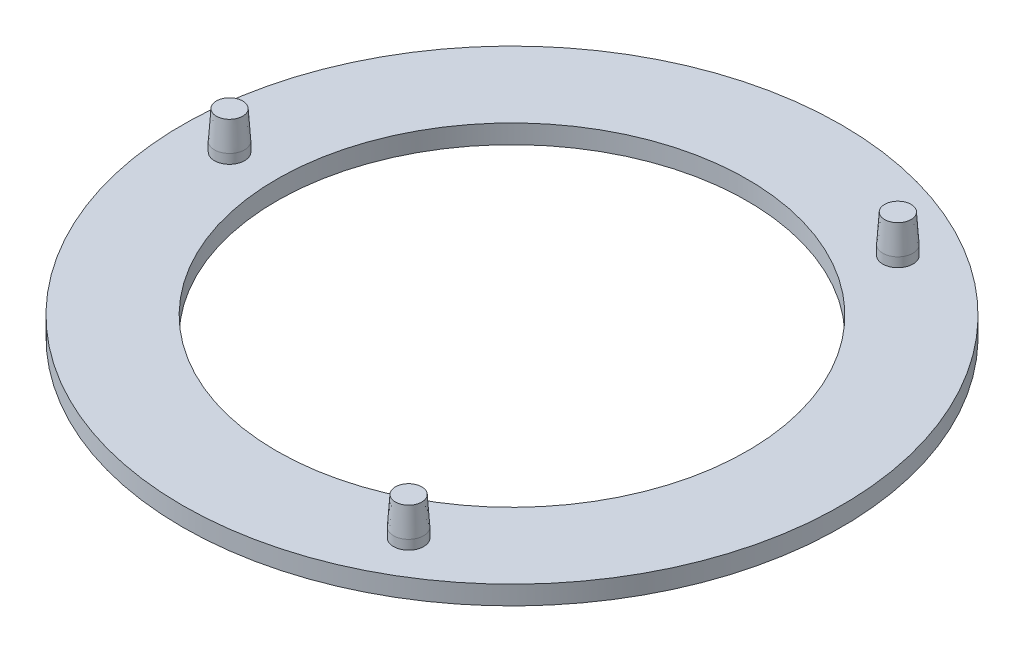
ISO-10303-21;
HEADER;
FILE_DESCRIPTION(('STEP AP214'),'2;1');
FILE_NAME('part.step','',(''),(''),'','','');
FILE_SCHEMA(('AUTOMOTIVE_DESIGN { 1 0 10303 214 1 1 1 1 }'));
ENDSEC;
DATA;
#1=APPLICATION_CONTEXT('core data for automotive mechanical design processes');
#2=APPLICATION_PROTOCOL_DEFINITION('international standard','automotive_design',2000,#1);
#3=PRODUCT_CONTEXT('',#1,'mechanical');
#4=PRODUCT('Part','Part','',(#3));
#5=PRODUCT_RELATED_PRODUCT_CATEGORY('part','',(#4));
#6=PRODUCT_DEFINITION_FORMATION('','',#4);
#7=PRODUCT_DEFINITION_CONTEXT('part definition',#1,'design');
#8=PRODUCT_DEFINITION('design','',#6,#7);
#9=PRODUCT_DEFINITION_SHAPE('','',#8);
#10=(LENGTH_UNIT() NAMED_UNIT(*) SI_UNIT(.MILLI.,.METRE.));
#11=(NAMED_UNIT(*) PLANE_ANGLE_UNIT() SI_UNIT($,.RADIAN.));
#12=(NAMED_UNIT(*) SI_UNIT($,.STERADIAN.) SOLID_ANGLE_UNIT());
#13=UNCERTAINTY_MEASURE_WITH_UNIT(LENGTH_MEASURE(1.E-05),#10,'distance_accuracy_value','');
#14=(GEOMETRIC_REPRESENTATION_CONTEXT(3) GLOBAL_UNCERTAINTY_ASSIGNED_CONTEXT((#13)) GLOBAL_UNIT_ASSIGNED_CONTEXT((#10,
#11,#12)) REPRESENTATION_CONTEXT('',''));
#15=CARTESIAN_POINT('',(0.,0.,0.));
#16=DIRECTION('',(0.,0.,1.));
#17=DIRECTION('',(1.,0.,0.));
#18=AXIS2_PLACEMENT_3D('',#15,#16,#17);
#19=CARTESIAN_POINT('',(0.,2.54,0.));
#20=DIRECTION('',(0.,1.,0.));
#21=DIRECTION('',(0.,0.,1.));
#22=AXIS2_PLACEMENT_3D('',#19,#20,#21);
#23=PLANE('',#22);
#24=CARTESIAN_POINT('',(19.0500000000001,2.54,-32.9955678841871));
#25=DIRECTION('',(0.,-1.,0.));
#26=DIRECTION('',(0.866025403784438,0.,0.500000000000002));
#27=AXIS2_PLACEMENT_3D('',#24,#25,#26);
#28=CIRCLE('',#27,2.032);
#29=CARTESIAN_POINT('',(20.80976362049,2.54,-31.9795678841871));
#30=VERTEX_POINT('',#29);
#31=EDGE_CURVE('E63',#30,#30,#28,.T.);
#32=ORIENTED_EDGE('',*,*,#31,.T.);
#33=EDGE_LOOP('',(#32));
#34=FACE_BOUND('',#33,.T.);
#35=CARTESIAN_POINT('',(0.,2.54,0.));
#36=DIRECTION('',(0.,1.,0.));
#37=DIRECTION('',(0.,0.,1.));
#38=AXIS2_PLACEMENT_3D('',#35,#36,#37);
#39=CIRCLE('',#38,31.75);
#40=CARTESIAN_POINT('',(0.,2.54,31.75));
#41=VERTEX_POINT('',#40);
#42=EDGE_CURVE('E41',#41,#41,#39,.T.);
#43=ORIENTED_EDGE('',*,*,#42,.F.);
#44=EDGE_LOOP('',(#43));
#45=FACE_BOUND('',#44,.T.);
#46=CARTESIAN_POINT('',(0.,2.54,0.));
#47=DIRECTION('',(0.,1.,0.));
#48=DIRECTION('',(0.,0.,1.));
#49=AXIS2_PLACEMENT_3D('',#46,#47,#48);
#50=CIRCLE('',#49,44.45);
#51=CARTESIAN_POINT('',(0.,2.54,44.45));
#52=VERTEX_POINT('',#51);
#53=EDGE_CURVE('E10',#52,#52,#50,.T.);
#54=ORIENTED_EDGE('',*,*,#53,.T.);
#55=EDGE_LOOP('',(#54));
#56=FACE_BOUND('',#55,.T.);
#57=CARTESIAN_POINT('',(-38.1,2.54,0.));
#58=DIRECTION('',(0.,-1.,0.));
#59=DIRECTION('',(0.,0.,-1.));
#60=AXIS2_PLACEMENT_3D('',#57,#58,#59);
#61=CIRCLE('',#60,2.032);
#62=CARTESIAN_POINT('',(-38.1,2.54,-2.032));
#63=VERTEX_POINT('',#62);
#64=EDGE_CURVE('E54',#63,#63,#61,.T.);
#65=ORIENTED_EDGE('',*,*,#64,.T.);
#66=EDGE_LOOP('',(#65));
#67=FACE_BOUND('',#66,.T.);
#68=CARTESIAN_POINT('',(19.0499999999999,2.54,32.9955678841872));
#69=DIRECTION('',(0.,-1.,0.));
#70=DIRECTION('',(-0.866025403784441,0.,0.499999999999997));
#71=AXIS2_PLACEMENT_3D('',#68,#69,#70);
#72=CIRCLE('',#71,2.032);
#73=CARTESIAN_POINT('',(17.2902363795099,2.54,34.0115678841872));
#74=VERTEX_POINT('',#73);
#75=EDGE_CURVE('E72',#74,#74,#72,.T.);
#76=ORIENTED_EDGE('',*,*,#75,.T.);
#77=EDGE_LOOP('',(#76));
#78=FACE_BOUND('',#77,.T.);
#79=ADVANCED_FACE('F30',(#34,#45,#56,#67,#78),#23,.T.);
#80=CARTESIAN_POINT('',(0.,0.,0.));
#81=DIRECTION('',(0.,1.,0.));
#82=DIRECTION('',(0.,0.,1.));
#83=AXIS2_PLACEMENT_3D('',#80,#81,#82);
#84=PLANE('',#83);
#85=CARTESIAN_POINT('',(0.,0.,0.));
#86=DIRECTION('',(0.,1.,0.));
#87=DIRECTION('',(0.,0.,1.));
#88=AXIS2_PLACEMENT_3D('',#85,#86,#87);
#89=CIRCLE('',#88,44.45);
#90=CARTESIAN_POINT('',(0.,0.,44.45));
#91=VERTEX_POINT('',#90);
#92=EDGE_CURVE('E34',#91,#91,#89,.T.);
#93=ORIENTED_EDGE('',*,*,#92,.F.);
#94=EDGE_LOOP('',(#93));
#95=FACE_BOUND('',#94,.T.);
#96=CARTESIAN_POINT('',(0.,0.,0.));
#97=DIRECTION('',(0.,1.,0.));
#98=DIRECTION('',(0.,0.,1.));
#99=AXIS2_PLACEMENT_3D('',#96,#97,#98);
#100=CIRCLE('',#99,31.75);
#101=CARTESIAN_POINT('',(0.,0.,31.75));
#102=VERTEX_POINT('',#101);
#103=EDGE_CURVE('E43',#102,#102,#100,.T.);
#104=ORIENTED_EDGE('',*,*,#103,.T.);
#105=EDGE_LOOP('',(#104));
#106=FACE_BOUND('',#105,.T.);
#107=ADVANCED_FACE('F100',(#95,#106),#84,.F.);
#108=CARTESIAN_POINT('',(0.,2.54,0.));
#109=DIRECTION('',(0.,-1.,0.));
#110=DIRECTION('',(0.,0.,-1.));
#111=AXIS2_PLACEMENT_3D('',#108,#109,#110);
#112=CYLINDRICAL_SURFACE('',#111,44.45);
#113=ORIENTED_EDGE('',*,*,#53,.F.);
#114=EDGE_LOOP('',(#113));
#115=FACE_BOUND('',#114,.T.);
#116=ORIENTED_EDGE('',*,*,#92,.T.);
#117=EDGE_LOOP('',(#116));
#118=FACE_BOUND('',#117,.T.);
#119=ADVANCED_FACE('F32',(#115,#118),#112,.T.);
#120=CARTESIAN_POINT('',(0.,2.54,0.));
#121=DIRECTION('',(0.,-1.,0.));
#122=DIRECTION('',(0.,0.,-1.));
#123=AXIS2_PLACEMENT_3D('',#120,#121,#122);
#124=CYLINDRICAL_SURFACE('',#123,31.75);
#125=ORIENTED_EDGE('',*,*,#42,.T.);
#126=EDGE_LOOP('',(#125));
#127=FACE_BOUND('',#126,.T.);
#128=ORIENTED_EDGE('',*,*,#103,.F.);
#129=EDGE_LOOP('',(#128));
#130=FACE_BOUND('',#129,.T.);
#131=ADVANCED_FACE('F109',(#127,#130),#124,.F.);
#132=CARTESIAN_POINT('',(-38.1,7.62,0.));
#133=DIRECTION('',(0.,-1.,0.));
#134=DIRECTION('',(0.,0.,-1.));
#135=AXIS2_PLACEMENT_3D('',#132,#133,#134);
#136=PLANE('',#135);
#137=CARTESIAN_POINT('',(-38.1,7.62,0.));
#138=DIRECTION('',(0.,-1.,0.));
#139=DIRECTION('',(0.,0.,-1.));
#140=AXIS2_PLACEMENT_3D('',#137,#138,#139);
#141=CIRCLE('',#140,1.778);
#142=CARTESIAN_POINT('',(-38.1,7.62,-1.778));
#143=VERTEX_POINT('',#142);
#144=EDGE_CURVE('E46',#143,#143,#141,.T.);
#145=ORIENTED_EDGE('',*,*,#144,.F.);
#146=EDGE_LOOP('',(#145));
#147=FACE_BOUND('',#146,.T.);
#148=ADVANCED_FACE('F112',(#147),#136,.F.);
#149=CARTESIAN_POINT('',(-38.1,7.62,0.));
#150=DIRECTION('',(0.,-1.,0.));
#151=DIRECTION('',(0.,0.,-1.));
#152=AXIS2_PLACEMENT_3D('',#149,#150,#151);
#153=CONICAL_SURFACE('',#152,1.778,0.0665681637758231);
#154=CARTESIAN_POINT('',(-38.1,3.81,0.));
#155=DIRECTION('',(0.,-1.,0.));
#156=DIRECTION('',(0.,0.,-1.));
#157=AXIS2_PLACEMENT_3D('',#154,#155,#156);
#158=CIRCLE('',#157,2.032);
#159=CARTESIAN_POINT('',(-38.1,3.81,-2.032));
#160=VERTEX_POINT('',#159);
#161=EDGE_CURVE('E51',#160,#160,#158,.T.);
#162=ORIENTED_EDGE('',*,*,#161,.F.);
#163=EDGE_LOOP('',(#162));
#164=FACE_BOUND('',#163,.T.);
#165=ORIENTED_EDGE('',*,*,#144,.T.);
#166=EDGE_LOOP('',(#165));
#167=FACE_BOUND('',#166,.T.);
#168=ADVANCED_FACE('F116',(#164,#167),#153,.T.);
#169=CARTESIAN_POINT('',(-38.1,2.54,0.));
#170=DIRECTION('',(0.,-1.,0.));
#171=DIRECTION('',(0.,0.,-1.));
#172=AXIS2_PLACEMENT_3D('',#169,#170,#171);
#173=CYLINDRICAL_SURFACE('',#172,2.032);
#174=ORIENTED_EDGE('',*,*,#64,.F.);
#175=EDGE_LOOP('',(#174));
#176=FACE_BOUND('',#175,.T.);
#177=ORIENTED_EDGE('',*,*,#161,.T.);
#178=EDGE_LOOP('',(#177));
#179=FACE_BOUND('',#178,.T.);
#180=ADVANCED_FACE('F120',(#176,#179),#173,.T.);
#181=CARTESIAN_POINT('',(19.0500000000001,7.62,-32.9955678841871));
#182=DIRECTION('',(0.,-1.,0.));
#183=DIRECTION('',(0.866025403784438,0.,0.500000000000002));
#184=AXIS2_PLACEMENT_3D('',#181,#182,#183);
#185=PLANE('',#184);
#186=CARTESIAN_POINT('',(19.0500000000001,7.62,-32.9955678841871));
#187=DIRECTION('',(0.,-1.,0.));
#188=DIRECTION('',(0.866025403784438,0.,0.500000000000002));
#189=AXIS2_PLACEMENT_3D('',#186,#187,#188);
#190=CIRCLE('',#189,1.778);
#191=CARTESIAN_POINT('',(20.5897931679288,7.62,-32.1065678841871));
#192=VERTEX_POINT('',#191);
#193=EDGE_CURVE('E57',#192,#192,#190,.T.);
#194=ORIENTED_EDGE('',*,*,#193,.F.);
#195=EDGE_LOOP('',(#194));
#196=FACE_BOUND('',#195,.T.);
#197=ADVANCED_FACE('F124',(#196),#185,.F.);
#198=CARTESIAN_POINT('',(19.0500000000001,7.62,-32.9955678841871));
#199=DIRECTION('',(0.,-1.,0.));
#200=DIRECTION('',(0.866025403784438,0.,0.500000000000002));
#201=AXIS2_PLACEMENT_3D('',#198,#199,#200);
#202=CONICAL_SURFACE('',#201,1.778,0.0665681637758231);
#203=CARTESIAN_POINT('',(19.0500000000001,3.81,-32.9955678841871));
#204=DIRECTION('',(0.,-1.,0.));
#205=DIRECTION('',(0.866025403784438,0.,0.500000000000002));
#206=AXIS2_PLACEMENT_3D('',#203,#204,#205);
#207=CIRCLE('',#206,2.032);
#208=CARTESIAN_POINT('',(20.80976362049,3.81,-31.9795678841871));
#209=VERTEX_POINT('',#208);
#210=EDGE_CURVE('E60',#209,#209,#207,.T.);
#211=ORIENTED_EDGE('',*,*,#210,.F.);
#212=EDGE_LOOP('',(#211));
#213=FACE_BOUND('',#212,.T.);
#214=ORIENTED_EDGE('',*,*,#193,.T.);
#215=EDGE_LOOP('',(#214));
#216=FACE_BOUND('',#215,.T.);
#217=ADVANCED_FACE('F96',(#213,#216),#202,.T.);
#218=CARTESIAN_POINT('',(19.0500000000001,2.54,-32.9955678841871));
#219=DIRECTION('',(0.,-1.,0.));
#220=DIRECTION('',(0.866025403784438,0.,0.500000000000002));
#221=AXIS2_PLACEMENT_3D('',#218,#219,#220);
#222=CYLINDRICAL_SURFACE('',#221,2.032);
#223=ORIENTED_EDGE('',*,*,#31,.F.);
#224=EDGE_LOOP('',(#223));
#225=FACE_BOUND('',#224,.T.);
#226=ORIENTED_EDGE('',*,*,#210,.T.);
#227=EDGE_LOOP('',(#226));
#228=FACE_BOUND('',#227,.T.);
#229=ADVANCED_FACE('F91',(#225,#228),#222,.T.);
#230=CARTESIAN_POINT('',(19.0499999999999,7.62,32.9955678841872));
#231=DIRECTION('',(0.,-1.,0.));
#232=DIRECTION('',(-0.866025403784441,0.,0.499999999999997));
#233=AXIS2_PLACEMENT_3D('',#230,#231,#232);
#234=PLANE('',#233);
#235=CARTESIAN_POINT('',(19.0499999999999,7.62,32.9955678841872));
#236=DIRECTION('',(0.,-1.,0.));
#237=DIRECTION('',(-0.866025403784441,0.,0.499999999999997));
#238=AXIS2_PLACEMENT_3D('',#235,#236,#237);
#239=CIRCLE('',#238,1.778);
#240=CARTESIAN_POINT('',(17.5102068320711,7.62,33.8845678841872));
#241=VERTEX_POINT('',#240);
#242=EDGE_CURVE('E66',#241,#241,#239,.T.);
#243=ORIENTED_EDGE('',*,*,#242,.F.);
#244=EDGE_LOOP('',(#243));
#245=FACE_BOUND('',#244,.T.);
#246=ADVANCED_FACE('F86',(#245),#234,.F.);
#247=CARTESIAN_POINT('',(19.0499999999999,7.62,32.9955678841872));
#248=DIRECTION('',(0.,-1.,0.));
#249=DIRECTION('',(-0.866025403784441,0.,0.499999999999997));
#250=AXIS2_PLACEMENT_3D('',#247,#248,#249);
#251=CONICAL_SURFACE('',#250,1.778,0.0665681637758231);
#252=CARTESIAN_POINT('',(19.0499999999999,3.81,32.9955678841872));
#253=DIRECTION('',(0.,-1.,0.));
#254=DIRECTION('',(-0.866025403784441,0.,0.499999999999997));
#255=AXIS2_PLACEMENT_3D('',#252,#253,#254);
#256=CIRCLE('',#255,2.032);
#257=CARTESIAN_POINT('',(17.2902363795099,3.81,34.0115678841872));
#258=VERTEX_POINT('',#257);
#259=EDGE_CURVE('E69',#258,#258,#256,.T.);
#260=ORIENTED_EDGE('',*,*,#259,.F.);
#261=EDGE_LOOP('',(#260));
#262=FACE_BOUND('',#261,.T.);
#263=ORIENTED_EDGE('',*,*,#242,.T.);
#264=EDGE_LOOP('',(#263));
#265=FACE_BOUND('',#264,.T.);
#266=ADVANCED_FACE('F80',(#262,#265),#251,.T.);
#267=CARTESIAN_POINT('',(19.0499999999999,2.54,32.9955678841872));
#268=DIRECTION('',(0.,-1.,0.));
#269=DIRECTION('',(-0.866025403784441,0.,0.499999999999997));
#270=AXIS2_PLACEMENT_3D('',#267,#268,#269);
#271=CYLINDRICAL_SURFACE('',#270,2.032);
#272=ORIENTED_EDGE('',*,*,#75,.F.);
#273=EDGE_LOOP('',(#272));
#274=FACE_BOUND('',#273,.T.);
#275=ORIENTED_EDGE('',*,*,#259,.T.);
#276=EDGE_LOOP('',(#275));
#277=FACE_BOUND('',#276,.T.);
#278=ADVANCED_FACE('F77',(#274,#277),#271,.T.);
#279=CLOSED_SHELL('',(#79,#107,#119,#131,#148,#168,#180,#197,#217,#229,#246,#266,#278));
#280=MANIFOLD_SOLID_BREP('B2',#279);
#281=ADVANCED_BREP_SHAPE_REPRESENTATION('',(#18,#280),#14);
#282=SHAPE_DEFINITION_REPRESENTATION(#9,#281);
ENDSEC;
END-ISO-10303-21;
